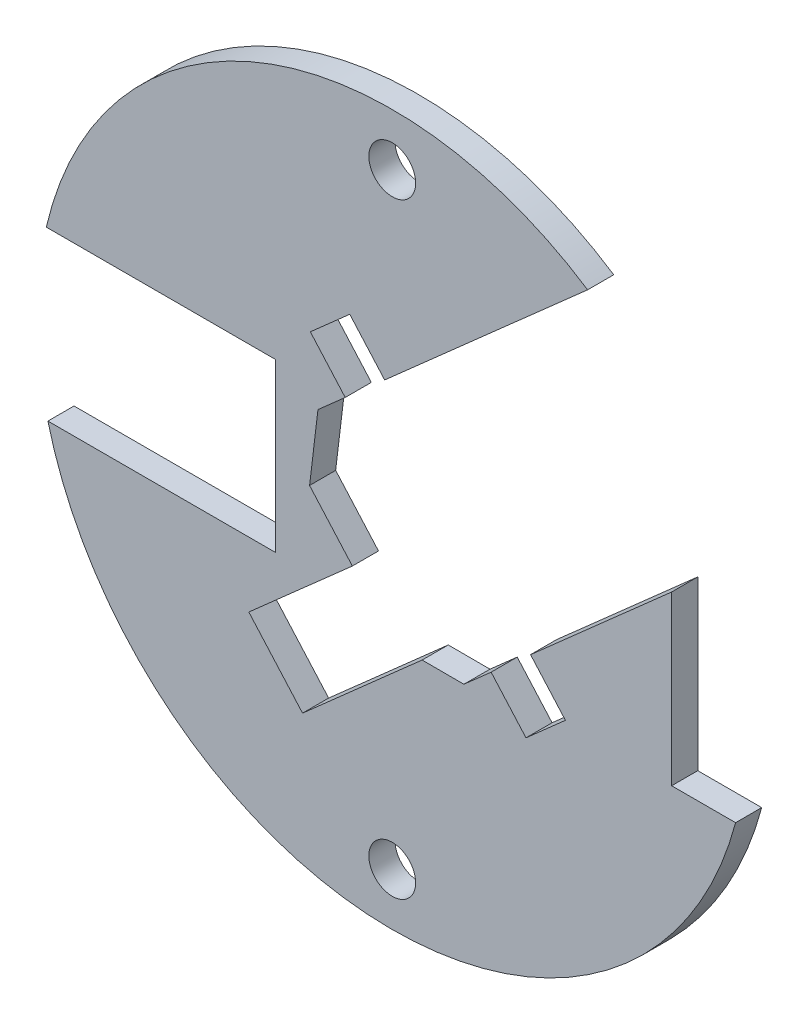
ISO-10303-21;
HEADER;
FILE_DESCRIPTION(('STEP AP214'),'2;1');
FILE_NAME('part.step','',(''),(''),'','','');
FILE_SCHEMA(('AUTOMOTIVE_DESIGN { 1 0 10303 214 1 1 1 1 }'));
ENDSEC;
DATA;
#1=APPLICATION_CONTEXT('core data for automotive mechanical design processes');
#2=APPLICATION_PROTOCOL_DEFINITION('international standard','automotive_design',2000,#1);
#3=PRODUCT_CONTEXT('',#1,'mechanical');
#4=PRODUCT('Part','Part','',(#3));
#5=PRODUCT_RELATED_PRODUCT_CATEGORY('part','',(#4));
#6=PRODUCT_DEFINITION_FORMATION('','',#4);
#7=PRODUCT_DEFINITION_CONTEXT('part definition',#1,'design');
#8=PRODUCT_DEFINITION('design','',#6,#7);
#9=PRODUCT_DEFINITION_SHAPE('','',#8);
#10=(LENGTH_UNIT() NAMED_UNIT(*) SI_UNIT(.MILLI.,.METRE.));
#11=(NAMED_UNIT(*) PLANE_ANGLE_UNIT() SI_UNIT($,.RADIAN.));
#12=(NAMED_UNIT(*) SI_UNIT($,.STERADIAN.) SOLID_ANGLE_UNIT());
#13=UNCERTAINTY_MEASURE_WITH_UNIT(LENGTH_MEASURE(1.E-05),#10,'distance_accuracy_value','');
#14=(GEOMETRIC_REPRESENTATION_CONTEXT(3) GLOBAL_UNCERTAINTY_ASSIGNED_CONTEXT((#13)) GLOBAL_UNIT_ASSIGNED_CONTEXT((#10,
#11,#12)) REPRESENTATION_CONTEXT('',''));
#15=CARTESIAN_POINT('',(0.,0.,0.));
#16=DIRECTION('',(0.,0.,1.));
#17=DIRECTION('',(1.,0.,0.));
#18=AXIS2_PLACEMENT_3D('',#15,#16,#17);
#19=CARTESIAN_POINT('',(0.,0.,1.5875));
#20=DIRECTION('',(0.,0.,-1.));
#21=DIRECTION('',(-1.,0.,0.));
#22=AXIS2_PLACEMENT_3D('',#19,#20,#21);
#23=CYLINDRICAL_SURFACE('',#22,21.59);
#24=CARTESIAN_POINT('',(0.,0.,0.));
#25=DIRECTION('',(0.,0.,1.));
#26=DIRECTION('',(1.,0.,0.));
#27=AXIS2_PLACEMENT_3D('',#24,#25,#26);
#28=CIRCLE('',#27,21.59);
#29=CARTESIAN_POINT('',(-20.9336068980002,-5.2832,0.));
#30=VERTEX_POINT('',#29);
#31=CARTESIAN_POINT('',(20.8712242034338,-5.5245,0.));
#32=VERTEX_POINT('',#31);
#33=EDGE_CURVE('E206',#30,#32,#28,.T.);
#34=ORIENTED_EDGE('',*,*,#33,.T.);
#35=DIRECTION('',(0.,0.,-1.));
#36=VECTOR('',#35,1.);
#37=CARTESIAN_POINT('',(20.8712242034338,-5.5245,1.5875));
#38=LINE('',#37,#36);
#39=CARTESIAN_POINT('',(20.8712242034338,-5.5245,1.5875));
#40=VERTEX_POINT('',#39);
#41=EDGE_CURVE('E50',#40,#32,#38,.T.);
#42=ORIENTED_EDGE('',*,*,#41,.F.);
#43=CARTESIAN_POINT('',(0.,0.,1.5875));
#44=DIRECTION('',(0.,0.,1.));
#45=DIRECTION('',(1.,0.,0.));
#46=AXIS2_PLACEMENT_3D('',#43,#44,#45);
#47=CIRCLE('',#46,21.59);
#48=CARTESIAN_POINT('',(-20.9336068980002,-5.2832,1.5875));
#49=VERTEX_POINT('',#48);
#50=EDGE_CURVE('E204',#49,#40,#47,.T.);
#51=ORIENTED_EDGE('',*,*,#50,.F.);
#52=DIRECTION('',(0.,0.,1.));
#53=VECTOR('',#52,1.);
#54=CARTESIAN_POINT('',(-20.9336068980002,-5.2832,0.));
#55=LINE('',#54,#53);
#56=EDGE_CURVE('E388',#30,#49,#55,.T.);
#57=ORIENTED_EDGE('',*,*,#56,.F.);
#58=EDGE_LOOP('',(#34,#42,#51,#57));
#59=FACE_BOUND('',#58,.T.);
#60=ADVANCED_FACE('F35',(#59),#23,.T.);
#61=CARTESIAN_POINT('',(-3.73426164317338,4.22147900554515,1.5875));
#62=DIRECTION('',(-0.66256157635468,0.749007448252954,0.));
#63=DIRECTION('',(-0.749007448252954,-0.66256157635468,0.));
#64=AXIS2_PLACEMENT_3D('',#61,#62,#63);
#65=PLANE('',#64);
#66=DIRECTION('',(0.749007448252954,0.66256157635468,0.));
#67=VECTOR('',#66,1.);
#68=CARTESIAN_POINT('',(-3.73426164317338,4.22147900554515,0.));
#69=LINE('',#68,#67);
#70=CARTESIAN_POINT('',(-0.463016976136372,7.11517656261124,0.));
#71=VERTEX_POINT('',#70);
#72=CARTESIAN_POINT('',(11.8760761518911,18.0301668110554,0.));
#73=VERTEX_POINT('',#72);
#74=EDGE_CURVE('E268',#71,#73,#69,.T.);
#75=ORIENTED_EDGE('',*,*,#74,.T.);
#76=DIRECTION('',(0.,0.,-1.));
#77=VECTOR('',#76,1.);
#78=CARTESIAN_POINT('',(11.8760761518911,18.0301668110554,1.5875));
#79=LINE('',#78,#77);
#80=CARTESIAN_POINT('',(11.8760761518911,18.0301668110554,1.5875));
#81=VERTEX_POINT('',#80);
#82=EDGE_CURVE('E11',#81,#73,#79,.T.);
#83=ORIENTED_EDGE('',*,*,#82,.F.);
#84=DIRECTION('',(0.749007448252954,0.66256157635468,0.));
#85=VECTOR('',#84,1.);
#86=CARTESIAN_POINT('',(-3.73426164317338,4.22147900554515,1.5875));
#87=LINE('',#86,#85);
#88=CARTESIAN_POINT('',(-0.463016976136372,7.11517656261124,1.5875));
#89=VERTEX_POINT('',#88);
#90=EDGE_CURVE('E215',#89,#81,#87,.T.);
#91=ORIENTED_EDGE('',*,*,#90,.F.);
#92=DIRECTION('',(0.,0.,-1.));
#93=VECTOR('',#92,1.);
#94=CARTESIAN_POINT('',(-0.463016976136372,7.11517656261124,1.5875));
#95=LINE('',#94,#93);
#96=EDGE_CURVE('E267',#89,#71,#95,.T.);
#97=ORIENTED_EDGE('',*,*,#96,.T.);
#98=EDGE_LOOP('',(#75,#83,#91,#97));
#99=FACE_BOUND('',#98,.T.);
#100=ADVANCED_FACE('F37',(#99),#65,.F.);
#101=CARTESIAN_POINT('',(-21.0319975694179,4.8768,0.));
#102=VERTEX_POINT('',#101);
#103=EDGE_CURVE('E272',#73,#102,#28,.T.);
#104=ORIENTED_EDGE('',*,*,#103,.T.);
#105=DIRECTION('',(0.,0.,1.));
#106=VECTOR('',#105,1.);
#107=CARTESIAN_POINT('',(-21.0319975694179,4.8768,0.));
#108=LINE('',#107,#106);
#109=CARTESIAN_POINT('',(-21.0319975694179,4.8768,1.5875));
#110=VERTEX_POINT('',#109);
#111=EDGE_CURVE('E58',#102,#110,#108,.T.);
#112=ORIENTED_EDGE('',*,*,#111,.T.);
#113=EDGE_CURVE('E214',#81,#110,#47,.T.);
#114=ORIENTED_EDGE('',*,*,#113,.F.);
#115=ORIENTED_EDGE('',*,*,#82,.T.);
#116=EDGE_LOOP('',(#104,#112,#114,#115));
#117=FACE_BOUND('',#116,.T.);
#118=ADVANCED_FACE('F400',(#117),#23,.T.);
#119=CARTESIAN_POINT('',(5.1346551055952,-5.8045848952793,1.5875));
#120=DIRECTION('',(-0.662561576354684,0.74900744825295,0.));
#121=DIRECTION('',(-0.74900744825295,-0.662561576354684,0.));
#122=AXIS2_PLACEMENT_3D('',#119,#120,#121);
#123=PLANE('',#122);
#124=DIRECTION('',(0.,0.,-1.));
#125=VECTOR('',#124,1.);
#126=CARTESIAN_POINT('',(16.9840587441892,4.67723283825864,1.5875));
#127=LINE('',#126,#125);
#128=CARTESIAN_POINT('',(16.9840587441892,4.67723283825864,1.5875));
#129=VERTEX_POINT('',#128);
#130=CARTESIAN_POINT('',(16.9840587441892,4.67723283825864,0.));
#131=VERTEX_POINT('',#130);
#132=EDGE_CURVE('E367',#129,#131,#127,.T.);
#133=ORIENTED_EDGE('',*,*,#132,.T.);
#134=DIRECTION('',(0.74900744825295,0.662561576354684,0.));
#135=VECTOR('',#134,1.);
#136=CARTESIAN_POINT('',(5.1346551055952,-5.8045848952793,0.));
#137=LINE('',#136,#135);
#138=CARTESIAN_POINT('',(8.40589977263213,-2.91088733821317,0.));
#139=VERTEX_POINT('',#138);
#140=EDGE_CURVE('E275',#139,#131,#137,.T.);
#141=ORIENTED_EDGE('',*,*,#140,.F.);
#142=DIRECTION('',(0.,0.,-1.));
#143=VECTOR('',#142,1.);
#144=CARTESIAN_POINT('',(8.40589977263213,-2.91088733821317,1.5875));
#145=LINE('',#144,#143);
#146=CARTESIAN_POINT('',(8.40589977263213,-2.91088733821317,1.5875));
#147=VERTEX_POINT('',#146);
#148=EDGE_CURVE('E43',#147,#139,#145,.T.);
#149=ORIENTED_EDGE('',*,*,#148,.F.);
#150=DIRECTION('',(0.74900744825295,0.662561576354684,0.));
#151=VECTOR('',#150,1.);
#152=CARTESIAN_POINT('',(5.1346551055952,-5.8045848952793,1.5875));
#153=LINE('',#152,#151);
#154=EDGE_CURVE('E218',#147,#129,#153,.T.);
#155=ORIENTED_EDGE('',*,*,#154,.T.);
#156=EDGE_LOOP('',(#133,#141,#149,#155));
#157=FACE_BOUND('',#156,.T.);
#158=ADVANCED_FACE('F366',(#157),#123,.T.);
#159=CARTESIAN_POINT('',(3.27124466703702,2.8936975570661,1.5875));
#160=DIRECTION('',(0.749007448252954,0.662561576354679,0.));
#161=DIRECTION('',(-0.662561576354679,0.749007448252955,0.));
#162=AXIS2_PLACEMENT_3D('',#159,#160,#161);
#163=PLANE('',#162);
#164=DIRECTION('',(0.662561576354679,-0.749007448252955,0.));
#165=VECTOR('',#164,1.);
#166=CARTESIAN_POINT('',(3.27124466703702,2.8936975570661,0.));
#167=LINE('',#166,#165);
#168=CARTESIAN_POINT('',(10.5263618415976,-5.30801077560191,0.));
#169=VERTEX_POINT('',#168);
#170=EDGE_CURVE('E278',#139,#169,#167,.T.);
#171=ORIENTED_EDGE('',*,*,#170,.T.);
#172=DIRECTION('',(0.,0.,-1.));
#173=VECTOR('',#172,1.);
#174=CARTESIAN_POINT('',(10.5263618415976,-5.30801077560191,1.5875));
#175=LINE('',#174,#173);
#176=CARTESIAN_POINT('',(10.5263618415976,-5.30801077560191,1.5875));
#177=VERTEX_POINT('',#176);
#178=EDGE_CURVE('E349',#177,#169,#175,.T.);
#179=ORIENTED_EDGE('',*,*,#178,.F.);
#180=DIRECTION('',(0.662561576354679,-0.749007448252955,0.));
#181=VECTOR('',#180,1.);
#182=CARTESIAN_POINT('',(3.27124466703702,2.8936975570661,1.5875));
#183=LINE('',#182,#181);
#184=EDGE_CURVE('E226',#147,#177,#183,.T.);
#185=ORIENTED_EDGE('',*,*,#184,.F.);
#186=ORIENTED_EDGE('',*,*,#148,.T.);
#187=EDGE_LOOP('',(#171,#179,#185,#186));
#188=FACE_BOUND('',#187,.T.);
#189=ADVANCED_FACE('F354',(#188),#163,.F.);
#190=CARTESIAN_POINT('',(7.2551171745606,-8.20170833266801,1.5875));
#191=DIRECTION('',(0.662561576354679,-0.749007448252954,0.));
#192=DIRECTION('',(0.749007448252955,0.662561576354679,0.));
#193=AXIS2_PLACEMENT_3D('',#190,#191,#192);
#194=PLANE('',#193);
#195=DIRECTION('',(-0.749007448252955,-0.662561576354679,0.));
#196=VECTOR('',#195,1.);
#197=CARTESIAN_POINT('',(7.2551171745606,-8.20170833266801,0.));
#198=LINE('',#197,#196);
#199=CARTESIAN_POINT('',(8.12923840420887,-7.42847284456742,0.));
#200=VERTEX_POINT('',#199);
#201=EDGE_CURVE('E280',#169,#200,#198,.T.);
#202=ORIENTED_EDGE('',*,*,#201,.T.);
#203=DIRECTION('',(0.,0.,-1.));
#204=VECTOR('',#203,1.);
#205=CARTESIAN_POINT('',(8.12923840420887,-7.42847284456742,1.5875));
#206=LINE('',#205,#204);
#207=CARTESIAN_POINT('',(8.12923840420887,-7.42847284456742,1.5875));
#208=VERTEX_POINT('',#207);
#209=EDGE_CURVE('E346',#208,#200,#206,.T.);
#210=ORIENTED_EDGE('',*,*,#209,.F.);
#211=DIRECTION('',(-0.749007448252955,-0.662561576354679,0.));
#212=VECTOR('',#211,1.);
#213=CARTESIAN_POINT('',(7.2551171745606,-8.20170833266801,1.5875));
#214=LINE('',#213,#212);
#215=EDGE_CURVE('E228',#177,#208,#214,.T.);
#216=ORIENTED_EDGE('',*,*,#215,.F.);
#217=ORIENTED_EDGE('',*,*,#178,.T.);
#218=EDGE_LOOP('',(#202,#210,#216,#217));
#219=FACE_BOUND('',#218,.T.);
#220=ADVANCED_FACE('F429',(#219),#194,.F.);
#221=CARTESIAN_POINT('',(0.87412122964825,0.773235488100572,1.5875));
#222=DIRECTION('',(-0.749007448252954,-0.66256157635468,0.));
#223=DIRECTION('',(0.66256157635468,-0.749007448252954,0.));
#224=AXIS2_PLACEMENT_3D('',#221,#222,#223);
#225=PLANE('',#224);
#226=DIRECTION('',(-0.66256157635468,0.749007448252954,0.));
#227=VECTOR('',#226,1.);
#228=CARTESIAN_POINT('',(0.87412122964825,0.773235488100572,0.));
#229=LINE('',#228,#227);
#230=CARTESIAN_POINT('',(6.00877633524335,-5.03134940717868,0.));
#231=VERTEX_POINT('',#230);
#232=EDGE_CURVE('E282',#200,#231,#229,.T.);
#233=ORIENTED_EDGE('',*,*,#232,.T.);
#234=DIRECTION('',(0.,0.,-1.));
#235=VECTOR('',#234,1.);
#236=CARTESIAN_POINT('',(6.00877633524335,-5.03134940717868,1.5875));
#237=LINE('',#236,#235);
#238=CARTESIAN_POINT('',(6.00877633524335,-5.03134940717868,1.5875));
#239=VERTEX_POINT('',#238);
#240=EDGE_CURVE('E343',#239,#231,#237,.T.);
#241=ORIENTED_EDGE('',*,*,#240,.F.);
#242=DIRECTION('',(-0.66256157635468,0.749007448252954,0.));
#243=VECTOR('',#242,1.);
#244=CARTESIAN_POINT('',(0.87412122964825,0.773235488100572,1.5875));
#245=LINE('',#244,#243);
#246=EDGE_CURVE('E230',#208,#239,#245,.T.);
#247=ORIENTED_EDGE('',*,*,#246,.F.);
#248=ORIENTED_EDGE('',*,*,#209,.T.);
#249=EDGE_LOOP('',(#233,#241,#247,#248));
#250=FACE_BOUND('',#249,.T.);
#251=ADVANCED_FACE('F434',(#250),#225,.F.);
#252=CARTESIAN_POINT('',(5.13465510559506,-5.80458489527928,1.5875));
#253=DIRECTION('',(0.662561576354675,-0.749007448252958,0.));
#254=DIRECTION('',(0.749007448252958,0.662561576354675,0.));
#255=AXIS2_PLACEMENT_3D('',#252,#253,#254);
#256=PLANE('',#255);
#257=DIRECTION('',(-0.749007448252958,-0.662561576354675,0.));
#258=VECTOR('',#257,1.);
#259=CARTESIAN_POINT('',(5.13465510559506,-5.80458489527928,0.));
#260=LINE('',#259,#258);
#261=CARTESIAN_POINT('',(4.35363559063623,-6.49546390082439,0.));
#262=VERTEX_POINT('',#261);
#263=EDGE_CURVE('E284',#231,#262,#260,.T.);
#264=ORIENTED_EDGE('',*,*,#263,.T.);
#265=DIRECTION('',(0.,0.,-1.));
#266=VECTOR('',#265,1.);
#267=CARTESIAN_POINT('',(4.35363559063623,-6.49546390082439,1.5875));
#268=LINE('',#267,#266);
#269=CARTESIAN_POINT('',(4.35363559063623,-6.49546390082439,1.5875));
#270=VERTEX_POINT('',#269);
#271=EDGE_CURVE('E341',#270,#262,#268,.T.);
#272=ORIENTED_EDGE('',*,*,#271,.F.);
#273=DIRECTION('',(-0.749007448252958,-0.662561576354675,0.));
#274=VECTOR('',#273,1.);
#275=CARTESIAN_POINT('',(5.13465510559506,-5.80458489527928,1.5875));
#276=LINE('',#275,#274);
#277=EDGE_CURVE('E232',#239,#270,#276,.T.);
#278=ORIENTED_EDGE('',*,*,#277,.F.);
#279=ORIENTED_EDGE('',*,*,#240,.T.);
#280=EDGE_LOOP('',(#264,#272,#278,#279));
#281=FACE_BOUND('',#280,.T.);
#282=ADVANCED_FACE('F438',(#281),#256,.F.);
#283=CARTESIAN_POINT('',(-0.0155994113088783,-6.48495380376542,1.5875));
#284=DIRECTION('',(0.00240547067095578,0.99999710685124,0.));
#285=DIRECTION('',(-0.99999710685124,0.00240547067095578,0.));
#286=AXIS2_PLACEMENT_3D('',#283,#284,#285);
#287=PLANE('',#286);
#288=DIRECTION('',(0.99999710685124,-0.00240547067095578,0.));
#289=VECTOR('',#288,1.);
#290=CARTESIAN_POINT('',(-0.0155994113088783,-6.48495380376542,0.));
#291=LINE('',#290,#289);
#292=CARTESIAN_POINT('',(1.81598170172832,-6.48935963116103,0.));
#293=VERTEX_POINT('',#292);
#294=EDGE_CURVE('E287',#293,#262,#291,.T.);
#295=ORIENTED_EDGE('',*,*,#294,.F.);
#296=DIRECTION('',(0.,0.,-1.));
#297=VECTOR('',#296,1.);
#298=CARTESIAN_POINT('',(1.81598170172832,-6.48935963116103,1.5875));
#299=LINE('',#298,#297);
#300=CARTESIAN_POINT('',(1.81598170172832,-6.48935963116103,1.5875));
#301=VERTEX_POINT('',#300);
#302=EDGE_CURVE('E339',#301,#293,#299,.T.);
#303=ORIENTED_EDGE('',*,*,#302,.F.);
#304=DIRECTION('',(0.99999710685124,-0.00240547067095578,0.));
#305=VECTOR('',#304,1.);
#306=CARTESIAN_POINT('',(-0.0155994113088783,-6.48495380376542,1.5875));
#307=LINE('',#306,#305);
#308=EDGE_CURVE('E234',#301,#270,#307,.T.);
#309=ORIENTED_EDGE('',*,*,#308,.T.);
#310=ORIENTED_EDGE('',*,*,#271,.T.);
#311=EDGE_LOOP('',(#295,#303,#309,#310));
#312=FACE_BOUND('',#311,.T.);
#313=ADVANCED_FACE('F442',(#312),#287,.T.);
#314=CARTESIAN_POINT('',(4.01762657342154,-4.54181518395331,1.5875));
#315=DIRECTION('',(-0.66256157635468,0.749007448252954,0.));
#316=DIRECTION('',(-0.749007448252954,-0.66256157635468,0.));
#317=AXIS2_PLACEMENT_3D('',#314,#315,#316);
#318=PLANE('',#317);
#319=DIRECTION('',(0.749007448252954,0.66256157635468,0.));
#320=VECTOR('',#319,1.);
#321=CARTESIAN_POINT('',(4.01762657342154,-4.54181518395331,0.));
#322=LINE('',#321,#320);
#323=CARTESIAN_POINT('',(-5.45545460102563,-12.9215711002895,0.));
#324=VERTEX_POINT('',#323);
#325=EDGE_CURVE('E290',#324,#293,#322,.T.);
#326=ORIENTED_EDGE('',*,*,#325,.F.);
#327=DIRECTION('',(0.,0.,-1.));
#328=VECTOR('',#327,1.);
#329=CARTESIAN_POINT('',(-5.45545460102563,-12.9215711002895,1.5875));
#330=LINE('',#329,#328);
#331=CARTESIAN_POINT('',(-5.45545460102563,-12.9215711002895,1.5875));
#332=VERTEX_POINT('',#331);
#333=EDGE_CURVE('E337',#332,#324,#330,.T.);
#334=ORIENTED_EDGE('',*,*,#333,.F.);
#335=DIRECTION('',(0.749007448252954,0.66256157635468,0.));
#336=VECTOR('',#335,1.);
#337=CARTESIAN_POINT('',(4.01762657342154,-4.54181518395331,1.5875));
#338=LINE('',#337,#336);
#339=EDGE_CURVE('E237',#332,#301,#338,.T.);
#340=ORIENTED_EDGE('',*,*,#339,.T.);
#341=ORIENTED_EDGE('',*,*,#302,.T.);
#342=EDGE_LOOP('',(#326,#334,#340,#341));
#343=FACE_BOUND('',#342,.T.);
#344=ADVANCED_FACE('F446',(#343),#318,.T.);
#345=CARTESIAN_POINT('',(-9.47308117444717,-8.3797559163362,1.5875));
#346=DIRECTION('',(0.749007448252954,0.66256157635468,0.));
#347=DIRECTION('',(-0.66256157635468,0.749007448252954,0.));
#348=AXIS2_PLACEMENT_3D('',#345,#346,#347);
#349=PLANE('',#348);
#350=DIRECTION('',(0.66256157635468,-0.749007448252954,0.));
#351=VECTOR('',#350,1.);
#352=CARTESIAN_POINT('',(-9.47308117444717,-8.3797559163362,0.));
#353=LINE('',#352,#351);
#354=CARTESIAN_POINT('',(-8.72029302467095,-9.23076199827825,0.));
#355=VERTEX_POINT('',#354);
#356=EDGE_CURVE('E293',#355,#324,#353,.T.);
#357=ORIENTED_EDGE('',*,*,#356,.F.);
#358=DIRECTION('',(0.,0.,-1.));
#359=VECTOR('',#358,1.);
#360=CARTESIAN_POINT('',(-8.72029302467095,-9.23076199827825,1.5875));
#361=LINE('',#360,#359);
#362=CARTESIAN_POINT('',(-8.72029302467095,-9.23076199827825,1.5875));
#363=VERTEX_POINT('',#362);
#364=EDGE_CURVE('E335',#363,#355,#361,.T.);
#365=ORIENTED_EDGE('',*,*,#364,.F.);
#366=DIRECTION('',(0.66256157635468,-0.749007448252954,0.));
#367=VECTOR('',#366,1.);
#368=CARTESIAN_POINT('',(-9.47308117444717,-8.3797559163362,1.5875));
#369=LINE('',#368,#367);
#370=EDGE_CURVE('E240',#363,#332,#369,.T.);
#371=ORIENTED_EDGE('',*,*,#370,.T.);
#372=ORIENTED_EDGE('',*,*,#333,.T.);
#373=EDGE_LOOP('',(#357,#365,#371,#372));
#374=FACE_BOUND('',#373,.T.);
#375=ADVANCED_FACE('F450',(#374),#349,.T.);
#376=CARTESIAN_POINT('',(0.752788149776217,-0.851006081942052,1.5875));
#377=DIRECTION('',(-0.66256157635468,0.749007448252954,0.));
#378=DIRECTION('',(-0.749007448252954,-0.66256157635468,0.));
#379=AXIS2_PLACEMENT_3D('',#376,#377,#378);
#380=PLANE('',#379);
#381=DIRECTION('',(0.749007448252954,0.66256157635468,0.));
#382=VECTOR('',#381,1.);
#383=CARTESIAN_POINT('',(0.752788149776217,-0.851006081942052,0.));
#384=LINE('',#383,#382);
#385=CARTESIAN_POINT('',(-2.42537071711365,-3.66236123423557,0.));
#386=VERTEX_POINT('',#385);
#387=EDGE_CURVE('E296',#355,#386,#384,.T.);
#388=ORIENTED_EDGE('',*,*,#387,.T.);
#389=DIRECTION('',(0.,0.,-1.));
#390=VECTOR('',#389,1.);
#391=CARTESIAN_POINT('',(-2.42537071711365,-3.66236123423557,1.5875));
#392=LINE('',#391,#390);
#393=CARTESIAN_POINT('',(-2.42537071711365,-3.66236123423557,1.5875));
#394=VERTEX_POINT('',#393);
#395=EDGE_CURVE('E333',#394,#386,#392,.T.);
#396=ORIENTED_EDGE('',*,*,#395,.F.);
#397=DIRECTION('',(0.749007448252954,0.66256157635468,0.));
#398=VECTOR('',#397,1.);
#399=CARTESIAN_POINT('',(0.752788149776217,-0.851006081942052,1.5875));
#400=LINE('',#399,#398);
#401=EDGE_CURVE('E243',#363,#394,#400,.T.);
#402=ORIENTED_EDGE('',*,*,#401,.F.);
#403=ORIENTED_EDGE('',*,*,#364,.T.);
#404=EDGE_LOOP('',(#388,#396,#402,#403));
#405=FACE_BOUND('',#404,.T.);
#406=ADVANCED_FACE('F454',(#405),#380,.F.);
#407=CARTESIAN_POINT('',(-3.17815886688987,-2.81135515229351,1.5875));
#408=DIRECTION('',(0.749007448252954,0.66256157635468,0.));
#409=DIRECTION('',(-0.66256157635468,0.749007448252954,0.));
#410=AXIS2_PLACEMENT_3D('',#407,#408,#409);
#411=PLANE('',#410);
#412=DIRECTION('',(0.66256157635468,-0.749007448252954,0.));
#413=VECTOR('',#412,1.);
#414=CARTESIAN_POINT('',(-3.17815886688987,-2.81135515229351,0.));
#415=LINE('',#414,#413);
#416=CARTESIAN_POINT('',(-5.02756533764946,-0.720652535538369,0.));
#417=VERTEX_POINT('',#416);
#418=EDGE_CURVE('E299',#417,#386,#415,.T.);
#419=ORIENTED_EDGE('',*,*,#418,.F.);
#420=DIRECTION('',(0.,0.,-1.));
#421=VECTOR('',#420,1.);
#422=CARTESIAN_POINT('',(-5.02756533764946,-0.720652535538369,1.5875));
#423=LINE('',#422,#421);
#424=CARTESIAN_POINT('',(-5.02756533764946,-0.720652535538369,1.5875));
#425=VERTEX_POINT('',#424);
#426=EDGE_CURVE('E331',#425,#417,#423,.T.);
#427=ORIENTED_EDGE('',*,*,#426,.F.);
#428=DIRECTION('',(0.66256157635468,-0.749007448252954,0.));
#429=VECTOR('',#428,1.);
#430=CARTESIAN_POINT('',(-3.17815886688987,-2.81135515229351,1.5875));
#431=LINE('',#430,#429);
#432=EDGE_CURVE('E245',#425,#394,#431,.T.);
#433=ORIENTED_EDGE('',*,*,#432,.T.);
#434=ORIENTED_EDGE('',*,*,#395,.T.);
#435=EDGE_LOOP('',(#419,#427,#433,#434));
#436=FACE_BOUND('',#435,.T.);
#437=ADVANCED_FACE('F458',(#436),#411,.T.);
#438=CARTESIAN_POINT('',(-4.87000927917982,0.586845567740415,1.5875));
#439=DIRECTION('',(0.992817765614227,-0.119636467186111,0.));
#440=DIRECTION('',(0.119636467186111,0.992817765614227,0.));
#441=AXIS2_PLACEMENT_3D('',#438,#439,#440);
#442=PLANE('',#441);
#443=DIRECTION('',(-0.119636467186111,-0.992817765614227,0.));
#444=VECTOR('',#443,1.);
#445=CARTESIAN_POINT('',(-4.87000927917982,0.586845567740415,0.));
#446=LINE('',#445,#444);
#447=CARTESIAN_POINT('',(-4.51528115813224,3.5306,0.));
#448=VERTEX_POINT('',#447);
#449=EDGE_CURVE('E302',#448,#417,#446,.T.);
#450=ORIENTED_EDGE('',*,*,#449,.F.);
#451=DIRECTION('',(0.,0.,-1.));
#452=VECTOR('',#451,1.);
#453=CARTESIAN_POINT('',(-4.51528115813224,3.5306,1.5875));
#454=LINE('',#453,#452);
#455=CARTESIAN_POINT('',(-4.51528115813224,3.5306,1.5875));
#456=VERTEX_POINT('',#455);
#457=EDGE_CURVE('E329',#456,#448,#454,.T.);
#458=ORIENTED_EDGE('',*,*,#457,.F.);
#459=DIRECTION('',(-0.119636467186111,-0.992817765614227,0.));
#460=VECTOR('',#459,1.);
#461=CARTESIAN_POINT('',(-4.87000927917982,0.586845567740415,1.5875));
#462=LINE('',#461,#460);
#463=EDGE_CURVE('E248',#456,#425,#462,.T.);
#464=ORIENTED_EDGE('',*,*,#463,.T.);
#465=ORIENTED_EDGE('',*,*,#426,.T.);
#466=EDGE_LOOP('',(#450,#458,#464,#465));
#467=FACE_BOUND('',#466,.T.);
#468=ADVANCED_FACE('F462',(#467),#442,.T.);
#469=CARTESIAN_POINT('',(-3.73426164317338,4.22147900554515,1.5875));
#470=DIRECTION('',(0.66256157635468,-0.749007448252954,0.));
#471=DIRECTION('',(0.749007448252954,0.66256157635468,0.));
#472=AXIS2_PLACEMENT_3D('',#469,#470,#471);
#473=PLANE('',#472);
#474=DIRECTION('',(-0.749007448252954,-0.66256157635468,0.));
#475=VECTOR('',#474,1.);
#476=CARTESIAN_POINT('',(-3.73426164317338,4.22147900554515,0.));
#477=LINE('',#476,#475);
#478=CARTESIAN_POINT('',(-2.86014041352512,4.99471449364573,0.));
#479=VERTEX_POINT('',#478);
#480=EDGE_CURVE('E305',#479,#448,#477,.T.);
#481=ORIENTED_EDGE('',*,*,#480,.F.);
#482=DIRECTION('',(0.,0.,-1.));
#483=VECTOR('',#482,1.);
#484=CARTESIAN_POINT('',(-2.86014041352512,4.99471449364573,1.5875));
#485=LINE('',#484,#483);
#486=CARTESIAN_POINT('',(-2.86014041352512,4.99471449364573,1.5875));
#487=VERTEX_POINT('',#486);
#488=EDGE_CURVE('E327',#487,#479,#485,.T.);
#489=ORIENTED_EDGE('',*,*,#488,.F.);
#490=DIRECTION('',(-0.749007448252954,-0.66256157635468,0.));
#491=VECTOR('',#490,1.);
#492=CARTESIAN_POINT('',(-3.73426164317338,4.22147900554515,1.5875));
#493=LINE('',#492,#491);
#494=EDGE_CURVE('E251',#487,#456,#493,.T.);
#495=ORIENTED_EDGE('',*,*,#494,.T.);
#496=ORIENTED_EDGE('',*,*,#457,.T.);
#497=EDGE_LOOP('',(#481,#489,#495,#496));
#498=FACE_BOUND('',#497,.T.);
#499=ADVANCED_FACE('F466',(#498),#473,.T.);
#500=CARTESIAN_POINT('',(0.874121229648258,0.773235488100577,1.5875));
#501=DIRECTION('',(0.749007448252954,0.66256157635468,0.));
#502=DIRECTION('',(-0.66256157635468,0.749007448252954,0.));
#503=AXIS2_PLACEMENT_3D('',#500,#501,#502);
#504=PLANE('',#503);
#505=DIRECTION('',(0.66256157635468,-0.749007448252954,0.));
#506=VECTOR('',#505,1.);
#507=CARTESIAN_POINT('',(0.874121229648258,0.773235488100577,0.));
#508=LINE('',#507,#506);
#509=CARTESIAN_POINT('',(-4.98060248249064,7.39183793103448,0.));
#510=VERTEX_POINT('',#509);
#511=EDGE_CURVE('E308',#510,#479,#508,.T.);
#512=ORIENTED_EDGE('',*,*,#511,.F.);
#513=DIRECTION('',(0.,0.,-1.));
#514=VECTOR('',#513,1.);
#515=CARTESIAN_POINT('',(-4.98060248249064,7.39183793103448,1.5875));
#516=LINE('',#515,#514);
#517=CARTESIAN_POINT('',(-4.98060248249064,7.39183793103448,1.5875));
#518=VERTEX_POINT('',#517);
#519=EDGE_CURVE('E325',#518,#510,#516,.T.);
#520=ORIENTED_EDGE('',*,*,#519,.F.);
#521=DIRECTION('',(0.66256157635468,-0.749007448252954,0.));
#522=VECTOR('',#521,1.);
#523=CARTESIAN_POINT('',(0.874121229648258,0.773235488100577,1.5875));
#524=LINE('',#523,#522);
#525=EDGE_CURVE('E254',#518,#487,#524,.T.);
#526=ORIENTED_EDGE('',*,*,#525,.T.);
#527=ORIENTED_EDGE('',*,*,#488,.T.);
#528=EDGE_LOOP('',(#512,#520,#526,#527));
#529=FACE_BOUND('',#528,.T.);
#530=ADVANCED_FACE('F470',(#529),#504,.T.);
#531=CARTESIAN_POINT('',(-5.8547237121389,6.6186024429339,1.5875));
#532=DIRECTION('',(-0.66256157635468,0.749007448252954,0.));
#533=DIRECTION('',(-0.749007448252954,-0.66256157635468,0.));
#534=AXIS2_PLACEMENT_3D('',#531,#532,#533);
#535=PLANE('',#534);
#536=DIRECTION('',(0.749007448252954,0.66256157635468,0.));
#537=VECTOR('',#536,1.);
#538=CARTESIAN_POINT('',(-5.8547237121389,6.6186024429339,0.));
#539=LINE('',#538,#537);
#540=CARTESIAN_POINT('',(-2.58347904510189,9.51229999999999,0.));
#541=VERTEX_POINT('',#540);
#542=EDGE_CURVE('E311',#510,#541,#539,.T.);
#543=ORIENTED_EDGE('',*,*,#542,.T.);
#544=DIRECTION('',(0.,0.,-1.));
#545=VECTOR('',#544,1.);
#546=CARTESIAN_POINT('',(-2.58347904510189,9.51229999999999,1.5875));
#547=LINE('',#546,#545);
#548=CARTESIAN_POINT('',(-2.58347904510189,9.51229999999999,1.5875));
#549=VERTEX_POINT('',#548);
#550=EDGE_CURVE('E322',#549,#541,#547,.T.);
#551=ORIENTED_EDGE('',*,*,#550,.F.);
#552=DIRECTION('',(0.749007448252954,0.66256157635468,0.));
#553=VECTOR('',#552,1.);
#554=CARTESIAN_POINT('',(-5.8547237121389,6.6186024429339,1.5875));
#555=LINE('',#554,#553);
#556=EDGE_CURVE('E257',#518,#549,#555,.T.);
#557=ORIENTED_EDGE('',*,*,#556,.F.);
#558=ORIENTED_EDGE('',*,*,#519,.T.);
#559=EDGE_LOOP('',(#543,#551,#557,#558));
#560=FACE_BOUND('',#559,.T.);
#561=ADVANCED_FACE('F474',(#560),#535,.F.);
#562=CARTESIAN_POINT('',(0.,18.415,1.5875));
#563=DIRECTION('',(0.,0.,-1.));
#564=DIRECTION('',(-1.,0.,0.));
#565=AXIS2_PLACEMENT_3D('',#562,#563,#564);
#566=CYLINDRICAL_SURFACE('',#565,1.4224);
#567=CARTESIAN_POINT('',(0.,18.415,1.5875));
#568=DIRECTION('',(0.,0.,1.));
#569=DIRECTION('',(1.,0.,0.));
#570=AXIS2_PLACEMENT_3D('',#567,#568,#569);
#571=CIRCLE('',#570,1.4224);
#572=CARTESIAN_POINT('',(1.4224,18.415,1.5875));
#573=VERTEX_POINT('',#572);
#574=EDGE_CURVE('E261',#573,#573,#571,.T.);
#575=ORIENTED_EDGE('',*,*,#574,.T.);
#576=EDGE_LOOP('',(#575));
#577=FACE_BOUND('',#576,.T.);
#578=CARTESIAN_POINT('',(0.,18.415,0.));
#579=DIRECTION('',(0.,0.,1.));
#580=DIRECTION('',(1.,0.,0.));
#581=AXIS2_PLACEMENT_3D('',#578,#579,#580);
#582=CIRCLE('',#581,1.4224);
#583=CARTESIAN_POINT('',(1.4224,18.415,0.));
#584=VERTEX_POINT('',#583);
#585=EDGE_CURVE('E315',#584,#584,#582,.T.);
#586=ORIENTED_EDGE('',*,*,#585,.F.);
#587=EDGE_LOOP('',(#586));
#588=FACE_BOUND('',#587,.T.);
#589=ADVANCED_FACE('F478',(#577,#588),#566,.F.);
#590=CARTESIAN_POINT('',(3.27124466703701,2.89369755706609,1.5875));
#591=DIRECTION('',(0.749007448252954,0.66256157635468,0.));
#592=DIRECTION('',(-0.66256157635468,0.749007448252954,0.));
#593=AXIS2_PLACEMENT_3D('',#590,#591,#592);
#594=PLANE('',#593);
#595=DIRECTION('',(0.66256157635468,-0.749007448252954,0.));
#596=VECTOR('',#595,1.);
#597=CARTESIAN_POINT('',(3.27124466703701,2.89369755706609,0.));
#598=LINE('',#597,#596);
#599=EDGE_CURVE('E313',#541,#71,#598,.T.);
#600=ORIENTED_EDGE('',*,*,#599,.T.);
#601=ORIENTED_EDGE('',*,*,#96,.F.);
#602=DIRECTION('',(0.66256157635468,-0.749007448252954,0.));
#603=VECTOR('',#602,1.);
#604=CARTESIAN_POINT('',(3.27124466703701,2.89369755706609,1.5875));
#605=LINE('',#604,#603);
#606=EDGE_CURVE('E259',#549,#89,#605,.T.);
#607=ORIENTED_EDGE('',*,*,#606,.F.);
#608=ORIENTED_EDGE('',*,*,#550,.T.);
#609=EDGE_LOOP('',(#600,#601,#607,#608));
#610=FACE_BOUND('',#609,.T.);
#611=ADVANCED_FACE('F480',(#610),#594,.F.);
#612=CARTESIAN_POINT('',(0.,-18.415,1.5875));
#613=DIRECTION('',(0.,0.,-1.));
#614=DIRECTION('',(-1.,0.,0.));
#615=AXIS2_PLACEMENT_3D('',#612,#613,#614);
#616=CYLINDRICAL_SURFACE('',#615,1.4224);
#617=CARTESIAN_POINT('',(0.,-18.415,1.5875));
#618=DIRECTION('',(0.,0.,1.));
#619=DIRECTION('',(1.,0.,0.));
#620=AXIS2_PLACEMENT_3D('',#617,#618,#619);
#621=CIRCLE('',#620,1.4224);
#622=CARTESIAN_POINT('',(1.4224,-18.415,1.5875));
#623=VERTEX_POINT('',#622);
#624=EDGE_CURVE('E264',#623,#623,#621,.T.);
#625=ORIENTED_EDGE('',*,*,#624,.T.);
#626=EDGE_LOOP('',(#625));
#627=FACE_BOUND('',#626,.T.);
#628=CARTESIAN_POINT('',(0.,-18.415,0.));
#629=DIRECTION('',(0.,0.,1.));
#630=DIRECTION('',(1.,0.,0.));
#631=AXIS2_PLACEMENT_3D('',#628,#629,#630);
#632=CIRCLE('',#631,1.4224);
#633=CARTESIAN_POINT('',(1.4224,-18.415,0.));
#634=VERTEX_POINT('',#633);
#635=EDGE_CURVE('E220',#634,#634,#632,.T.);
#636=ORIENTED_EDGE('',*,*,#635,.F.);
#637=EDGE_LOOP('',(#636));
#638=FACE_BOUND('',#637,.T.);
#639=ADVANCED_FACE('F483',(#627,#638),#616,.F.);
#640=CARTESIAN_POINT('',(0.,0.,1.5875));
#641=DIRECTION('',(0.,0.,1.));
#642=DIRECTION('',(1.,0.,0.));
#643=AXIS2_PLACEMENT_3D('',#640,#641,#642);
#644=PLANE('',#643);
#645=DIRECTION('',(0.,1.,0.));
#646=VECTOR('',#645,1.);
#647=CARTESIAN_POINT('',(16.9840587441892,-5.5245,1.5875));
#648=LINE('',#647,#646);
#649=CARTESIAN_POINT('',(16.9840587441892,-5.5245,1.5875));
#650=VERTEX_POINT('',#649);
#651=EDGE_CURVE('E197',#650,#129,#648,.T.);
#652=ORIENTED_EDGE('',*,*,#651,.T.);
#653=ORIENTED_EDGE('',*,*,#154,.F.);
#654=ORIENTED_EDGE('',*,*,#184,.T.);
#655=ORIENTED_EDGE('',*,*,#215,.T.);
#656=ORIENTED_EDGE('',*,*,#246,.T.);
#657=ORIENTED_EDGE('',*,*,#277,.T.);
#658=ORIENTED_EDGE('',*,*,#308,.F.);
#659=ORIENTED_EDGE('',*,*,#339,.F.);
#660=ORIENTED_EDGE('',*,*,#370,.F.);
#661=ORIENTED_EDGE('',*,*,#401,.T.);
#662=ORIENTED_EDGE('',*,*,#432,.F.);
#663=ORIENTED_EDGE('',*,*,#463,.F.);
#664=ORIENTED_EDGE('',*,*,#494,.F.);
#665=ORIENTED_EDGE('',*,*,#525,.F.);
#666=ORIENTED_EDGE('',*,*,#556,.T.);
#667=ORIENTED_EDGE('',*,*,#606,.T.);
#668=ORIENTED_EDGE('',*,*,#90,.T.);
#669=ORIENTED_EDGE('',*,*,#113,.T.);
#670=DIRECTION('',(-1.,0.,0.));
#671=VECTOR('',#670,1.);
#672=CARTESIAN_POINT('',(0.,4.8768,1.5875));
#673=LINE('',#672,#671);
#674=CARTESIAN_POINT('',(-7.08496533764944,4.8768,1.5875));
#675=VERTEX_POINT('',#674);
#676=EDGE_CURVE('E371',#675,#110,#673,.T.);
#677=ORIENTED_EDGE('',*,*,#676,.F.);
#678=DIRECTION('',(0.,-1.,0.));
#679=VECTOR('',#678,1.);
#680=CARTESIAN_POINT('',(-7.08496533764944,0.,1.5875));
#681=LINE('',#680,#679);
#682=CARTESIAN_POINT('',(-7.08496533764946,-5.2832,1.5875));
#683=VERTEX_POINT('',#682);
#684=EDGE_CURVE('E369',#675,#683,#681,.T.);
#685=ORIENTED_EDGE('',*,*,#684,.T.);
#686=DIRECTION('',(1.,0.,0.));
#687=VECTOR('',#686,1.);
#688=CARTESIAN_POINT('',(0.,-5.2832,1.5875));
#689=LINE('',#688,#687);
#690=EDGE_CURVE('E213',#49,#683,#689,.T.);
#691=ORIENTED_EDGE('',*,*,#690,.F.);
#692=ORIENTED_EDGE('',*,*,#50,.T.);
#693=DIRECTION('',(-1.,0.,0.));
#694=VECTOR('',#693,1.);
#695=CARTESIAN_POINT('',(20.8712242034338,-5.5245,1.5875));
#696=LINE('',#695,#694);
#697=EDGE_CURVE('E190',#40,#650,#696,.T.);
#698=ORIENTED_EDGE('',*,*,#697,.T.);
#699=EDGE_LOOP('',(#652,#653,#654,#655,#656,#657,#658,#659,#660,#661,#662,#663,#664,#665,#666,
#667,#668,#669,#677,#685,#691,#692,#698));
#700=FACE_BOUND('',#699,.T.);
#701=ORIENTED_EDGE('',*,*,#574,.F.);
#702=EDGE_LOOP('',(#701));
#703=FACE_BOUND('',#702,.T.);
#704=ORIENTED_EDGE('',*,*,#624,.F.);
#705=EDGE_LOOP('',(#704));
#706=FACE_BOUND('',#705,.T.);
#707=ADVANCED_FACE('F209',(#700,#703,#706),#644,.T.);
#708=CARTESIAN_POINT('',(0.,0.,0.));
#709=DIRECTION('',(0.,0.,1.));
#710=DIRECTION('',(1.,0.,0.));
#711=AXIS2_PLACEMENT_3D('',#708,#709,#710);
#712=PLANE('',#711);
#713=ORIENTED_EDGE('',*,*,#140,.T.);
#714=DIRECTION('',(0.,1.,0.));
#715=VECTOR('',#714,1.);
#716=CARTESIAN_POINT('',(16.9840587441892,-5.5245,0.));
#717=LINE('',#716,#715);
#718=CARTESIAN_POINT('',(16.9840587441892,-5.5245,0.));
#719=VERTEX_POINT('',#718);
#720=EDGE_CURVE('E198',#719,#131,#717,.T.);
#721=ORIENTED_EDGE('',*,*,#720,.F.);
#722=DIRECTION('',(-1.,0.,0.));
#723=VECTOR('',#722,1.);
#724=CARTESIAN_POINT('',(20.8712242034338,-5.5245,0.));
#725=LINE('',#724,#723);
#726=EDGE_CURVE('E405',#32,#719,#725,.T.);
#727=ORIENTED_EDGE('',*,*,#726,.F.);
#728=ORIENTED_EDGE('',*,*,#33,.F.);
#729=DIRECTION('',(1.,0.,0.));
#730=VECTOR('',#729,1.);
#731=CARTESIAN_POINT('',(0.,-5.2832,0.));
#732=LINE('',#731,#730);
#733=CARTESIAN_POINT('',(-7.08496533764946,-5.2832,0.));
#734=VERTEX_POINT('',#733);
#735=EDGE_CURVE('E381',#30,#734,#732,.T.);
#736=ORIENTED_EDGE('',*,*,#735,.T.);
#737=DIRECTION('',(0.,-1.,0.));
#738=VECTOR('',#737,1.);
#739=CARTESIAN_POINT('',(-7.08496533764944,0.,0.));
#740=LINE('',#739,#738);
#741=CARTESIAN_POINT('',(-7.08496533764944,4.8768,0.));
#742=VERTEX_POINT('',#741);
#743=EDGE_CURVE('E377',#742,#734,#740,.T.);
#744=ORIENTED_EDGE('',*,*,#743,.F.);
#745=DIRECTION('',(-1.,0.,0.));
#746=VECTOR('',#745,1.);
#747=CARTESIAN_POINT('',(0.,4.8768,0.));
#748=LINE('',#747,#746);
#749=EDGE_CURVE('E379',#742,#102,#748,.T.);
#750=ORIENTED_EDGE('',*,*,#749,.T.);
#751=ORIENTED_EDGE('',*,*,#103,.F.);
#752=ORIENTED_EDGE('',*,*,#74,.F.);
#753=ORIENTED_EDGE('',*,*,#599,.F.);
#754=ORIENTED_EDGE('',*,*,#542,.F.);
#755=ORIENTED_EDGE('',*,*,#511,.T.);
#756=ORIENTED_EDGE('',*,*,#480,.T.);
#757=ORIENTED_EDGE('',*,*,#449,.T.);
#758=ORIENTED_EDGE('',*,*,#418,.T.);
#759=ORIENTED_EDGE('',*,*,#387,.F.);
#760=ORIENTED_EDGE('',*,*,#356,.T.);
#761=ORIENTED_EDGE('',*,*,#325,.T.);
#762=ORIENTED_EDGE('',*,*,#294,.T.);
#763=ORIENTED_EDGE('',*,*,#263,.F.);
#764=ORIENTED_EDGE('',*,*,#232,.F.);
#765=ORIENTED_EDGE('',*,*,#201,.F.);
#766=ORIENTED_EDGE('',*,*,#170,.F.);
#767=EDGE_LOOP('',(#713,#721,#727,#728,#736,#744,#750,#751,#752,#753,#754,#755,#756,#757,#758,
#759,#760,#761,#762,#763,#764,#765,#766));
#768=FACE_BOUND('',#767,.T.);
#769=ORIENTED_EDGE('',*,*,#585,.T.);
#770=EDGE_LOOP('',(#769));
#771=FACE_BOUND('',#770,.T.);
#772=ORIENTED_EDGE('',*,*,#635,.T.);
#773=EDGE_LOOP('',(#772));
#774=FACE_BOUND('',#773,.T.);
#775=ADVANCED_FACE('F361',(#768,#771,#774),#712,.F.);
#776=CARTESIAN_POINT('',(-7.08496533764944,0.,0.));
#777=DIRECTION('',(-1.,0.,0.));
#778=DIRECTION('',(0.,-1.,0.));
#779=AXIS2_PLACEMENT_3D('',#776,#777,#778);
#780=PLANE('',#779);
#781=ORIENTED_EDGE('',*,*,#684,.F.);
#782=DIRECTION('',(0.,0.,1.));
#783=VECTOR('',#782,1.);
#784=CARTESIAN_POINT('',(-7.08496533764944,4.8768,0.));
#785=LINE('',#784,#783);
#786=EDGE_CURVE('E383',#742,#675,#785,.T.);
#787=ORIENTED_EDGE('',*,*,#786,.F.);
#788=ORIENTED_EDGE('',*,*,#743,.T.);
#789=DIRECTION('',(0.,0.,1.));
#790=VECTOR('',#789,1.);
#791=CARTESIAN_POINT('',(-7.08496533764946,-5.2832,0.));
#792=LINE('',#791,#790);
#793=EDGE_CURVE('E271',#734,#683,#792,.T.);
#794=ORIENTED_EDGE('',*,*,#793,.T.);
#795=EDGE_LOOP('',(#781,#787,#788,#794));
#796=FACE_BOUND('',#795,.T.);
#797=ADVANCED_FACE('F395',(#796),#780,.T.);
#798=CARTESIAN_POINT('',(0.,-5.2832,0.));
#799=DIRECTION('',(0.,-1.,0.));
#800=DIRECTION('',(1.,0.,0.));
#801=AXIS2_PLACEMENT_3D('',#798,#799,#800);
#802=PLANE('',#801);
#803=ORIENTED_EDGE('',*,*,#690,.T.);
#804=ORIENTED_EDGE('',*,*,#793,.F.);
#805=ORIENTED_EDGE('',*,*,#735,.F.);
#806=ORIENTED_EDGE('',*,*,#56,.T.);
#807=EDGE_LOOP('',(#803,#804,#805,#806));
#808=FACE_BOUND('',#807,.T.);
#809=ADVANCED_FACE('F404',(#808),#802,.F.);
#810=CARTESIAN_POINT('',(0.,4.8768,0.));
#811=DIRECTION('',(0.,1.,0.));
#812=DIRECTION('',(-1.,0.,0.));
#813=AXIS2_PLACEMENT_3D('',#810,#811,#812);
#814=PLANE('',#813);
#815=ORIENTED_EDGE('',*,*,#676,.T.);
#816=ORIENTED_EDGE('',*,*,#111,.F.);
#817=ORIENTED_EDGE('',*,*,#749,.F.);
#818=ORIENTED_EDGE('',*,*,#786,.T.);
#819=EDGE_LOOP('',(#815,#816,#817,#818));
#820=FACE_BOUND('',#819,.T.);
#821=ADVANCED_FACE('F391',(#820),#814,.F.);
#822=CARTESIAN_POINT('',(16.9840587441892,-5.5245,1.5875));
#823=DIRECTION('',(-1.,0.,0.));
#824=DIRECTION('',(0.,0.,1.));
#825=AXIS2_PLACEMENT_3D('',#822,#823,#824);
#826=PLANE('',#825);
#827=ORIENTED_EDGE('',*,*,#720,.T.);
#828=ORIENTED_EDGE('',*,*,#132,.F.);
#829=ORIENTED_EDGE('',*,*,#651,.F.);
#830=DIRECTION('',(0.,0.,-1.));
#831=VECTOR('',#830,1.);
#832=CARTESIAN_POINT('',(16.9840587441892,-5.5245,1.5875));
#833=LINE('',#832,#831);
#834=EDGE_CURVE('E192',#650,#719,#833,.T.);
#835=ORIENTED_EDGE('',*,*,#834,.T.);
#836=EDGE_LOOP('',(#827,#828,#829,#835));
#837=FACE_BOUND('',#836,.T.);
#838=ADVANCED_FACE('F407',(#837),#826,.F.);
#839=CARTESIAN_POINT('',(20.8712242034338,-5.5245,1.5875));
#840=DIRECTION('',(0.,-1.,0.));
#841=DIRECTION('',(1.,0.,0.));
#842=AXIS2_PLACEMENT_3D('',#839,#840,#841);
#843=PLANE('',#842);
#844=ORIENTED_EDGE('',*,*,#726,.T.);
#845=ORIENTED_EDGE('',*,*,#834,.F.);
#846=ORIENTED_EDGE('',*,*,#697,.F.);
#847=ORIENTED_EDGE('',*,*,#41,.T.);
#848=EDGE_LOOP('',(#844,#845,#846,#847));
#849=FACE_BOUND('',#848,.T.);
#850=ADVANCED_FACE('F191',(#849),#843,.F.);
#851=CLOSED_SHELL('',(#60,#100,#118,#158,#189,#220,#251,#282,#313,#344,#375,#406,#437,#468,#499,
#530,#561,#589,#611,#639,#707,#775,#797,#809,#821,#838,#850));
#852=MANIFOLD_SOLID_BREP('B2',#851);
#853=ADVANCED_BREP_SHAPE_REPRESENTATION('',(#18,#852),#14);
#854=SHAPE_DEFINITION_REPRESENTATION(#9,#853);
ENDSEC;
END-ISO-10303-21;
